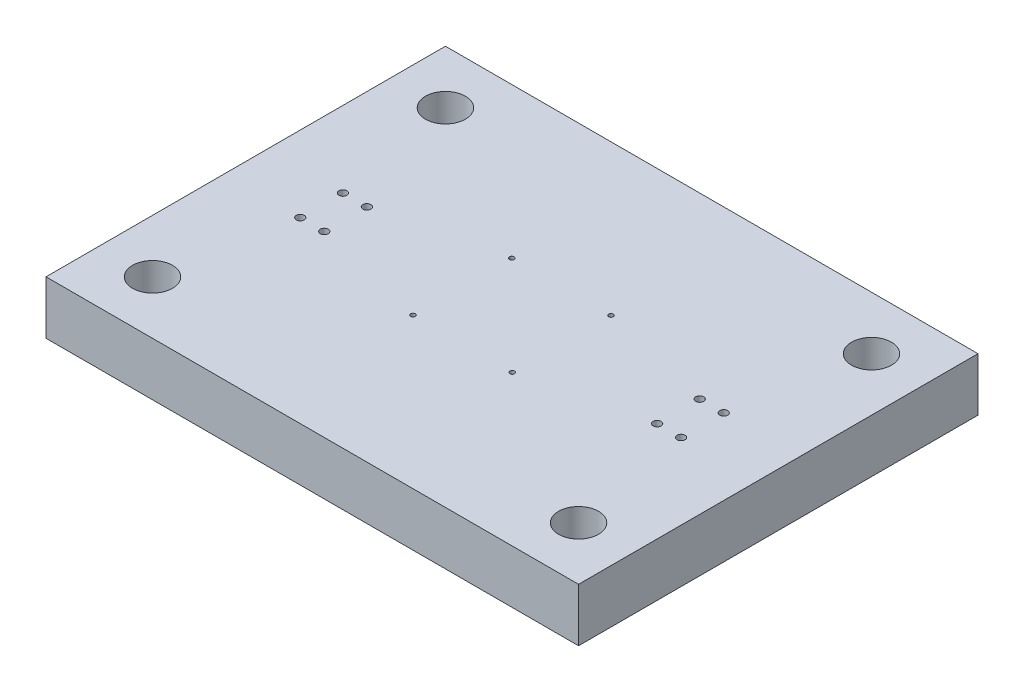
ISO-10303-21;
HEADER;
FILE_DESCRIPTION(('STEP AP214'),'2;1');
FILE_NAME('part.step','',(''),(''),'','','');
FILE_SCHEMA(('AUTOMOTIVE_DESIGN { 1 0 10303 214 1 1 1 1 }'));
ENDSEC;
DATA;
#1=APPLICATION_CONTEXT('core data for automotive mechanical design processes');
#2=APPLICATION_PROTOCOL_DEFINITION('international standard','automotive_design',2000,#1);
#3=PRODUCT_CONTEXT('',#1,'mechanical');
#4=PRODUCT('Part','Part','',(#3));
#5=PRODUCT_RELATED_PRODUCT_CATEGORY('part','',(#4));
#6=PRODUCT_DEFINITION_FORMATION('','',#4);
#7=PRODUCT_DEFINITION_CONTEXT('part definition',#1,'design');
#8=PRODUCT_DEFINITION('design','',#6,#7);
#9=PRODUCT_DEFINITION_SHAPE('','',#8);
#10=(LENGTH_UNIT() NAMED_UNIT(*) SI_UNIT(.MILLI.,.METRE.));
#11=(NAMED_UNIT(*) PLANE_ANGLE_UNIT() SI_UNIT($,.RADIAN.));
#12=(NAMED_UNIT(*) SI_UNIT($,.STERADIAN.) SOLID_ANGLE_UNIT());
#13=UNCERTAINTY_MEASURE_WITH_UNIT(LENGTH_MEASURE(1.E-05),#10,'distance_accuracy_value','');
#14=(GEOMETRIC_REPRESENTATION_CONTEXT(3) GLOBAL_UNCERTAINTY_ASSIGNED_CONTEXT((#13)) GLOBAL_UNIT_ASSIGNED_CONTEXT((#10,
#11,#12)) REPRESENTATION_CONTEXT('',''));
#15=CARTESIAN_POINT('',(0.,0.,0.));
#16=DIRECTION('',(0.,0.,1.));
#17=DIRECTION('',(1.,0.,0.));
#18=AXIS2_PLACEMENT_3D('',#15,#16,#17);
#19=CARTESIAN_POINT('',(100.,20.,-75.));
#20=DIRECTION('',(-1.,0.,0.));
#21=DIRECTION('',(0.,0.,1.));
#22=AXIS2_PLACEMENT_3D('',#19,#20,#21);
#23=PLANE('',#22);
#24=DIRECTION('',(0.,0.,-1.));
#25=VECTOR('',#24,1.);
#26=CARTESIAN_POINT('',(100.,0.,-75.));
#27=LINE('',#26,#25);
#28=CARTESIAN_POINT('',(100.,0.,75.));
#29=VERTEX_POINT('',#28);
#30=CARTESIAN_POINT('',(100.,0.,-75.));
#31=VERTEX_POINT('',#30);
#32=EDGE_CURVE('E99',#29,#31,#27,.T.);
#33=ORIENTED_EDGE('',*,*,#32,.T.);
#34=DIRECTION('',(0.,-1.,0.));
#35=VECTOR('',#34,1.);
#36=CARTESIAN_POINT('',(100.,20.,-75.));
#37=LINE('',#36,#35);
#38=CARTESIAN_POINT('',(100.,20.,-75.));
#39=VERTEX_POINT('',#38);
#40=EDGE_CURVE('E11',#39,#31,#37,.T.);
#41=ORIENTED_EDGE('',*,*,#40,.F.);
#42=DIRECTION('',(0.,0.,-1.));
#43=VECTOR('',#42,1.);
#44=CARTESIAN_POINT('',(100.,20.,-75.));
#45=LINE('',#44,#43);
#46=CARTESIAN_POINT('',(100.,20.,75.));
#47=VERTEX_POINT('',#46);
#48=EDGE_CURVE('E86',#47,#39,#45,.T.);
#49=ORIENTED_EDGE('',*,*,#48,.F.);
#50=DIRECTION('',(0.,-1.,0.));
#51=VECTOR('',#50,1.);
#52=CARTESIAN_POINT('',(100.,20.,75.));
#53=LINE('',#52,#51);
#54=EDGE_CURVE('E95',#47,#29,#53,.T.);
#55=ORIENTED_EDGE('',*,*,#54,.T.);
#56=EDGE_LOOP('',(#33,#41,#49,#55));
#57=FACE_BOUND('',#56,.T.);
#58=ADVANCED_FACE('F33',(#57),#23,.F.);
#59=CARTESIAN_POINT('',(-100.,20.,-75.));
#60=DIRECTION('',(0.,0.,1.));
#61=DIRECTION('',(1.,0.,0.));
#62=AXIS2_PLACEMENT_3D('',#59,#60,#61);
#63=PLANE('',#62);
#64=DIRECTION('',(-1.,0.,0.));
#65=VECTOR('',#64,1.);
#66=CARTESIAN_POINT('',(-100.,0.,-75.));
#67=LINE('',#66,#65);
#68=CARTESIAN_POINT('',(-100.,0.,-75.));
#69=VERTEX_POINT('',#68);
#70=EDGE_CURVE('E90',#31,#69,#67,.T.);
#71=ORIENTED_EDGE('',*,*,#70,.T.);
#72=DIRECTION('',(0.,-1.,0.));
#73=VECTOR('',#72,1.);
#74=CARTESIAN_POINT('',(-100.,20.,-75.));
#75=LINE('',#74,#73);
#76=CARTESIAN_POINT('',(-100.,20.,-75.));
#77=VERTEX_POINT('',#76);
#78=EDGE_CURVE('E42',#77,#69,#75,.T.);
#79=ORIENTED_EDGE('',*,*,#78,.F.);
#80=DIRECTION('',(-1.,0.,0.));
#81=VECTOR('',#80,1.);
#82=CARTESIAN_POINT('',(-100.,20.,-75.));
#83=LINE('',#82,#81);
#84=EDGE_CURVE('E81',#39,#77,#83,.T.);
#85=ORIENTED_EDGE('',*,*,#84,.F.);
#86=ORIENTED_EDGE('',*,*,#40,.T.);
#87=EDGE_LOOP('',(#71,#79,#85,#86));
#88=FACE_BOUND('',#87,.T.);
#89=ADVANCED_FACE('F89',(#88),#63,.F.);
#90=CARTESIAN_POINT('',(-100.,20.,-75.));
#91=DIRECTION('',(1.,0.,0.));
#92=DIRECTION('',(0.,0.,-1.));
#93=AXIS2_PLACEMENT_3D('',#90,#91,#92);
#94=PLANE('',#93);
#95=DIRECTION('',(0.,0.,1.));
#96=VECTOR('',#95,1.);
#97=CARTESIAN_POINT('',(-100.,0.,-75.));
#98=LINE('',#97,#96);
#99=CARTESIAN_POINT('',(-100.,0.,75.));
#100=VERTEX_POINT('',#99);
#101=EDGE_CURVE('E68',#69,#100,#98,.T.);
#102=ORIENTED_EDGE('',*,*,#101,.T.);
#103=DIRECTION('',(0.,-1.,0.));
#104=VECTOR('',#103,1.);
#105=CARTESIAN_POINT('',(-100.,20.,75.));
#106=LINE('',#105,#104);
#107=CARTESIAN_POINT('',(-100.,20.,75.));
#108=VERTEX_POINT('',#107);
#109=EDGE_CURVE('E91',#108,#100,#106,.T.);
#110=ORIENTED_EDGE('',*,*,#109,.F.);
#111=DIRECTION('',(0.,0.,1.));
#112=VECTOR('',#111,1.);
#113=CARTESIAN_POINT('',(-100.,20.,-75.));
#114=LINE('',#113,#112);
#115=EDGE_CURVE('E84',#77,#108,#114,.T.);
#116=ORIENTED_EDGE('',*,*,#115,.F.);
#117=ORIENTED_EDGE('',*,*,#78,.T.);
#118=EDGE_LOOP('',(#102,#110,#116,#117));
#119=FACE_BOUND('',#118,.T.);
#120=ADVANCED_FACE('F93',(#119),#94,.F.);
#121=CARTESIAN_POINT('',(-100.,20.,75.));
#122=DIRECTION('',(0.,0.,-1.));
#123=DIRECTION('',(-1.,0.,0.));
#124=AXIS2_PLACEMENT_3D('',#121,#122,#123);
#125=PLANE('',#124);
#126=DIRECTION('',(1.,0.,0.));
#127=VECTOR('',#126,1.);
#128=CARTESIAN_POINT('',(-100.,0.,75.));
#129=LINE('',#128,#127);
#130=EDGE_CURVE('E74',#100,#29,#129,.T.);
#131=ORIENTED_EDGE('',*,*,#130,.T.);
#132=ORIENTED_EDGE('',*,*,#54,.F.);
#133=DIRECTION('',(1.,0.,0.));
#134=VECTOR('',#133,1.);
#135=CARTESIAN_POINT('',(-100.,20.,75.));
#136=LINE('',#135,#134);
#137=EDGE_CURVE('E51',#108,#47,#136,.T.);
#138=ORIENTED_EDGE('',*,*,#137,.F.);
#139=ORIENTED_EDGE('',*,*,#109,.T.);
#140=EDGE_LOOP('',(#131,#132,#138,#139));
#141=FACE_BOUND('',#140,.T.);
#142=ADVANCED_FACE('F165',(#141),#125,.F.);
#143=CARTESIAN_POINT('',(0.,20.,0.));
#144=DIRECTION('',(0.,1.,0.));
#145=DIRECTION('',(0.,0.,1.));
#146=AXIS2_PLACEMENT_3D('',#143,#144,#145);
#147=PLANE('',#146);
#148=CARTESIAN_POINT('',(18.63,20.,-18.55));
#149=DIRECTION('',(0.,1.,0.));
#150=DIRECTION('',(0.,0.,-1.));
#151=AXIS2_PLACEMENT_3D('',#148,#149,#150);
#152=CIRCLE('',#151,0.875000000000002);
#153=CARTESIAN_POINT('',(18.63,20.,-19.425));
#154=VERTEX_POINT('',#153);
#155=EDGE_CURVE('E370',#154,#154,#152,.T.);
#156=ORIENTED_EDGE('',*,*,#155,.F.);
#157=EDGE_LOOP('',(#156));
#158=FACE_BOUND('',#157,.T.);
#159=CARTESIAN_POINT('',(-18.63,20.,18.55));
#160=DIRECTION('',(0.,1.,0.));
#161=DIRECTION('',(0.,0.,-1.));
#162=AXIS2_PLACEMENT_3D('',#159,#160,#161);
#163=CIRCLE('',#162,0.875000000000002);
#164=CARTESIAN_POINT('',(-18.63,20.,17.675));
#165=VERTEX_POINT('',#164);
#166=EDGE_CURVE('E376',#165,#165,#163,.T.);
#167=ORIENTED_EDGE('',*,*,#166,.F.);
#168=EDGE_LOOP('',(#167));
#169=FACE_BOUND('',#168,.T.);
#170=CARTESIAN_POINT('',(18.63,20.,18.55));
#171=DIRECTION('',(0.,1.,0.));
#172=DIRECTION('',(0.,0.,1.));
#173=AXIS2_PLACEMENT_3D('',#170,#171,#172);
#174=CIRCLE('',#173,0.875000000000002);
#175=CARTESIAN_POINT('',(18.63,20.,19.425));
#176=VERTEX_POINT('',#175);
#177=EDGE_CURVE('E468',#176,#176,#174,.T.);
#178=ORIENTED_EDGE('',*,*,#177,.F.);
#179=EDGE_LOOP('',(#178));
#180=FACE_BOUND('',#179,.T.);
#181=CARTESIAN_POINT('',(-18.63,20.,-18.55));
#182=DIRECTION('',(0.,1.,0.));
#183=DIRECTION('',(0.,0.,1.));
#184=AXIS2_PLACEMENT_3D('',#181,#182,#183);
#185=CIRCLE('',#184,0.875000000000002);
#186=CARTESIAN_POINT('',(-18.63,20.,-17.675));
#187=VERTEX_POINT('',#186);
#188=EDGE_CURVE('E373',#187,#187,#185,.T.);
#189=ORIENTED_EDGE('',*,*,#188,.F.);
#190=EDGE_LOOP('',(#189));
#191=FACE_BOUND('',#190,.T.);
#192=CARTESIAN_POINT('',(62.5,20.,-8.00000000000003));
#193=DIRECTION('',(0.,-1.,0.));
#194=DIRECTION('',(0.,0.,1.));
#195=AXIS2_PLACEMENT_3D('',#192,#193,#194);
#196=CIRCLE('',#195,1.50000000000002);
#197=CARTESIAN_POINT('',(62.5,20.,-6.50000000000001));
#198=VERTEX_POINT('',#197);
#199=EDGE_CURVE('E395',#198,#198,#196,.T.);
#200=ORIENTED_EDGE('',*,*,#199,.T.);
#201=EDGE_LOOP('',(#200));
#202=FACE_BOUND('',#201,.T.);
#203=CARTESIAN_POINT('',(-71.5,20.,-7.99999999999998));
#204=DIRECTION('',(0.,-1.,0.));
#205=DIRECTION('',(0.,0.,1.));
#206=AXIS2_PLACEMENT_3D('',#203,#204,#205);
#207=CIRCLE('',#206,1.5);
#208=CARTESIAN_POINT('',(-71.5,20.,-6.49999999999998));
#209=VERTEX_POINT('',#208);
#210=EDGE_CURVE('E398',#209,#209,#207,.T.);
#211=ORIENTED_EDGE('',*,*,#210,.T.);
#212=EDGE_LOOP('',(#211));
#213=FACE_BOUND('',#212,.T.);
#214=CARTESIAN_POINT('',(-62.5,20.,-7.99999999999997));
#215=DIRECTION('',(0.,-1.,0.));
#216=DIRECTION('',(0.,0.,-1.));
#217=AXIS2_PLACEMENT_3D('',#214,#215,#216);
#218=CIRCLE('',#217,1.5);
#219=CARTESIAN_POINT('',(-62.5,20.,-9.49999999999997));
#220=VERTEX_POINT('',#219);
#221=EDGE_CURVE('E401',#220,#220,#218,.T.);
#222=ORIENTED_EDGE('',*,*,#221,.T.);
#223=EDGE_LOOP('',(#222));
#224=FACE_BOUND('',#223,.T.);
#225=CARTESIAN_POINT('',(-62.5,20.,7.99999999999997));
#226=DIRECTION('',(0.,-1.,0.));
#227=DIRECTION('',(0.,0.,1.));
#228=AXIS2_PLACEMENT_3D('',#225,#226,#227);
#229=CIRCLE('',#228,1.5);
#230=CARTESIAN_POINT('',(-62.5,20.,9.49999999999997));
#231=VERTEX_POINT('',#230);
#232=EDGE_CURVE('E404',#231,#231,#229,.T.);
#233=ORIENTED_EDGE('',*,*,#232,.T.);
#234=EDGE_LOOP('',(#233));
#235=FACE_BOUND('',#234,.T.);
#236=CARTESIAN_POINT('',(71.5,20.,7.9999999999999));
#237=DIRECTION('',(0.,-1.,0.));
#238=DIRECTION('',(0.,0.,1.));
#239=AXIS2_PLACEMENT_3D('',#236,#237,#238);
#240=CIRCLE('',#239,1.5);
#241=CARTESIAN_POINT('',(71.5,20.,9.4999999999999));
#242=VERTEX_POINT('',#241);
#243=EDGE_CURVE('E386',#242,#242,#240,.T.);
#244=ORIENTED_EDGE('',*,*,#243,.T.);
#245=EDGE_LOOP('',(#244));
#246=FACE_BOUND('',#245,.T.);
#247=CARTESIAN_POINT('',(62.5,20.,7.99999999999992));
#248=DIRECTION('',(0.,-1.,0.));
#249=DIRECTION('',(0.,0.,-1.));
#250=AXIS2_PLACEMENT_3D('',#247,#248,#249);
#251=CIRCLE('',#250,1.49999999999999);
#252=CARTESIAN_POINT('',(62.5,20.,6.49999999999993));
#253=VERTEX_POINT('',#252);
#254=EDGE_CURVE('E391',#253,#253,#251,.T.);
#255=ORIENTED_EDGE('',*,*,#254,.T.);
#256=EDGE_LOOP('',(#255));
#257=FACE_BOUND('',#256,.T.);
#258=CARTESIAN_POINT('',(71.5,20.,-8.00000000000006));
#259=DIRECTION('',(0.,-1.,0.));
#260=DIRECTION('',(0.,0.,-1.));
#261=AXIS2_PLACEMENT_3D('',#258,#259,#260);
#262=CIRCLE('',#261,1.5);
#263=CARTESIAN_POINT('',(71.5,20.,-9.50000000000006));
#264=VERTEX_POINT('',#263);
#265=EDGE_CURVE('E392',#264,#264,#262,.T.);
#266=ORIENTED_EDGE('',*,*,#265,.T.);
#267=EDGE_LOOP('',(#266));
#268=FACE_BOUND('',#267,.T.);
#269=CARTESIAN_POINT('',(-71.5,20.,7.99999999999999));
#270=DIRECTION('',(0.,-1.,0.));
#271=DIRECTION('',(0.,0.,-1.));
#272=AXIS2_PLACEMENT_3D('',#269,#270,#271);
#273=CIRCLE('',#272,1.5);
#274=CARTESIAN_POINT('',(-71.5,20.,6.49999999999999));
#275=VERTEX_POINT('',#274);
#276=EDGE_CURVE('E112',#275,#275,#273,.T.);
#277=ORIENTED_EDGE('',*,*,#276,.T.);
#278=EDGE_LOOP('',(#277));
#279=FACE_BOUND('',#278,.T.);
#280=CARTESIAN_POINT('',(80.,20.,-54.9999999999999));
#281=DIRECTION('',(0.,1.,0.));
#282=DIRECTION('',(0.,0.,-1.));
#283=AXIS2_PLACEMENT_3D('',#280,#281,#282);
#284=CIRCLE('',#283,7.50000000000003);
#285=CARTESIAN_POINT('',(80.,20.,-62.4999999999999));
#286=VERTEX_POINT('',#285);
#287=EDGE_CURVE('E148',#286,#286,#284,.T.);
#288=ORIENTED_EDGE('',*,*,#287,.F.);
#289=EDGE_LOOP('',(#288));
#290=FACE_BOUND('',#289,.T.);
#291=CARTESIAN_POINT('',(-80.,20.,54.9999999999999));
#292=DIRECTION('',(0.,1.,0.));
#293=DIRECTION('',(0.,0.,-1.));
#294=AXIS2_PLACEMENT_3D('',#291,#292,#293);
#295=CIRCLE('',#294,7.50000000000002);
#296=CARTESIAN_POINT('',(-80.,20.,47.4999999999999));
#297=VERTEX_POINT('',#296);
#298=EDGE_CURVE('E140',#297,#297,#295,.T.);
#299=ORIENTED_EDGE('',*,*,#298,.F.);
#300=EDGE_LOOP('',(#299));
#301=FACE_BOUND('',#300,.T.);
#302=CARTESIAN_POINT('',(80.,20.,55.));
#303=DIRECTION('',(0.,1.,0.));
#304=DIRECTION('',(0.,0.,1.));
#305=AXIS2_PLACEMENT_3D('',#302,#303,#304);
#306=CIRCLE('',#305,7.50000000000002);
#307=CARTESIAN_POINT('',(80.,20.,62.5));
#308=VERTEX_POINT('',#307);
#309=EDGE_CURVE('E131',#308,#308,#306,.T.);
#310=ORIENTED_EDGE('',*,*,#309,.F.);
#311=EDGE_LOOP('',(#310));
#312=FACE_BOUND('',#311,.T.);
#313=CARTESIAN_POINT('',(-80.,20.,-55.));
#314=DIRECTION('',(0.,1.,0.));
#315=DIRECTION('',(0.,0.,1.));
#316=AXIS2_PLACEMENT_3D('',#313,#314,#315);
#317=CIRCLE('',#316,7.50000000000001);
#318=CARTESIAN_POINT('',(-80.,20.,-47.5));
#319=VERTEX_POINT('',#318);
#320=EDGE_CURVE('E147',#319,#319,#317,.T.);
#321=ORIENTED_EDGE('',*,*,#320,.F.);
#322=EDGE_LOOP('',(#321));
#323=FACE_BOUND('',#322,.T.);
#324=ORIENTED_EDGE('',*,*,#48,.T.);
#325=ORIENTED_EDGE('',*,*,#84,.T.);
#326=ORIENTED_EDGE('',*,*,#115,.T.);
#327=ORIENTED_EDGE('',*,*,#137,.T.);
#328=EDGE_LOOP('',(#324,#325,#326,#327));
#329=FACE_BOUND('',#328,.T.);
#330=ADVANCED_FACE('F82',(#158,#169,#180,#191,#202,#213,#224,#235,#246,#257,#268,#279,#290,#301,
#312,#323,#329),#147,.T.);
#331=CARTESIAN_POINT('',(0.,0.,0.));
#332=DIRECTION('',(0.,1.,0.));
#333=DIRECTION('',(0.,0.,1.));
#334=AXIS2_PLACEMENT_3D('',#331,#332,#333);
#335=PLANE('',#334);
#336=CARTESIAN_POINT('',(18.63,0.,-18.55));
#337=DIRECTION('',(0.,1.,0.));
#338=DIRECTION('',(0.,0.,-1.));
#339=AXIS2_PLACEMENT_3D('',#336,#337,#338);
#340=CIRCLE('',#339,0.875000000000002);
#341=CARTESIAN_POINT('',(18.63,0.,-19.425));
#342=VERTEX_POINT('',#341);
#343=EDGE_CURVE('E368',#342,#342,#340,.T.);
#344=ORIENTED_EDGE('',*,*,#343,.T.);
#345=EDGE_LOOP('',(#344));
#346=FACE_BOUND('',#345,.T.);
#347=CARTESIAN_POINT('',(-18.63,0.,18.55));
#348=DIRECTION('',(0.,1.,0.));
#349=DIRECTION('',(0.,0.,-1.));
#350=AXIS2_PLACEMENT_3D('',#347,#348,#349);
#351=CIRCLE('',#350,0.875000000000002);
#352=CARTESIAN_POINT('',(-18.63,0.,17.675));
#353=VERTEX_POINT('',#352);
#354=EDGE_CURVE('E371',#353,#353,#351,.T.);
#355=ORIENTED_EDGE('',*,*,#354,.T.);
#356=EDGE_LOOP('',(#355));
#357=FACE_BOUND('',#356,.T.);
#358=CARTESIAN_POINT('',(18.63,0.,18.55));
#359=DIRECTION('',(0.,1.,0.));
#360=DIRECTION('',(0.,0.,1.));
#361=AXIS2_PLACEMENT_3D('',#358,#359,#360);
#362=CIRCLE('',#361,0.875000000000002);
#363=CARTESIAN_POINT('',(18.63,0.,19.425));
#364=VERTEX_POINT('',#363);
#365=EDGE_CURVE('E382',#364,#364,#362,.T.);
#366=ORIENTED_EDGE('',*,*,#365,.T.);
#367=EDGE_LOOP('',(#366));
#368=FACE_BOUND('',#367,.T.);
#369=CARTESIAN_POINT('',(-18.63,0.,-18.55));
#370=DIRECTION('',(0.,1.,0.));
#371=DIRECTION('',(0.,0.,1.));
#372=AXIS2_PLACEMENT_3D('',#369,#370,#371);
#373=CIRCLE('',#372,0.875000000000002);
#374=CARTESIAN_POINT('',(-18.63,0.,-17.675));
#375=VERTEX_POINT('',#374);
#376=EDGE_CURVE('E383',#375,#375,#373,.T.);
#377=ORIENTED_EDGE('',*,*,#376,.T.);
#378=EDGE_LOOP('',(#377));
#379=FACE_BOUND('',#378,.T.);
#380=CARTESIAN_POINT('',(62.5,0.,-8.00000000000003));
#381=DIRECTION('',(0.,1.,0.));
#382=DIRECTION('',(0.,0.,1.));
#383=AXIS2_PLACEMENT_3D('',#380,#381,#382);
#384=CIRCLE('',#383,1.50000000000002);
#385=CARTESIAN_POINT('',(62.5,0.,-6.50000000000001));
#386=VERTEX_POINT('',#385);
#387=EDGE_CURVE('E36',#386,#386,#384,.T.);
#388=ORIENTED_EDGE('',*,*,#387,.T.);
#389=EDGE_LOOP('',(#388));
#390=FACE_BOUND('',#389,.T.);
#391=CARTESIAN_POINT('',(-71.5,0.,-7.99999999999998));
#392=DIRECTION('',(0.,1.,0.));
#393=DIRECTION('',(0.,0.,1.));
#394=AXIS2_PLACEMENT_3D('',#391,#392,#393);
#395=CIRCLE('',#394,1.5);
#396=CARTESIAN_POINT('',(-71.5,0.,-6.49999999999998));
#397=VERTEX_POINT('',#396);
#398=EDGE_CURVE('E126',#397,#397,#395,.T.);
#399=ORIENTED_EDGE('',*,*,#398,.T.);
#400=EDGE_LOOP('',(#399));
#401=FACE_BOUND('',#400,.T.);
#402=CARTESIAN_POINT('',(-62.5,0.,-7.99999999999997));
#403=DIRECTION('',(0.,1.,0.));
#404=DIRECTION('',(0.,0.,1.));
#405=AXIS2_PLACEMENT_3D('',#402,#403,#404);
#406=CIRCLE('',#405,1.5);
#407=CARTESIAN_POINT('',(-62.5,0.,-6.49999999999997));
#408=VERTEX_POINT('',#407);
#409=EDGE_CURVE('E124',#408,#408,#406,.T.);
#410=ORIENTED_EDGE('',*,*,#409,.T.);
#411=EDGE_LOOP('',(#410));
#412=FACE_BOUND('',#411,.T.);
#413=CARTESIAN_POINT('',(-62.5,0.,7.99999999999997));
#414=DIRECTION('',(0.,1.,0.));
#415=DIRECTION('',(0.,0.,1.));
#416=AXIS2_PLACEMENT_3D('',#413,#414,#415);
#417=CIRCLE('',#416,1.5);
#418=CARTESIAN_POINT('',(-62.5,0.,9.49999999999997));
#419=VERTEX_POINT('',#418);
#420=EDGE_CURVE('E121',#419,#419,#417,.T.);
#421=ORIENTED_EDGE('',*,*,#420,.T.);
#422=EDGE_LOOP('',(#421));
#423=FACE_BOUND('',#422,.T.);
#424=CARTESIAN_POINT('',(71.5,0.,7.9999999999999));
#425=DIRECTION('',(0.,1.,0.));
#426=DIRECTION('',(0.,0.,1.));
#427=AXIS2_PLACEMENT_3D('',#424,#425,#426);
#428=CIRCLE('',#427,1.5);
#429=CARTESIAN_POINT('',(71.5,0.,9.4999999999999));
#430=VERTEX_POINT('',#429);
#431=EDGE_CURVE('E118',#430,#430,#428,.T.);
#432=ORIENTED_EDGE('',*,*,#431,.T.);
#433=EDGE_LOOP('',(#432));
#434=FACE_BOUND('',#433,.T.);
#435=CARTESIAN_POINT('',(62.5,0.,7.99999999999992));
#436=DIRECTION('',(0.,1.,0.));
#437=DIRECTION('',(0.,0.,1.));
#438=AXIS2_PLACEMENT_3D('',#435,#436,#437);
#439=CIRCLE('',#438,1.49999999999999);
#440=CARTESIAN_POINT('',(62.5,0.,9.49999999999991));
#441=VERTEX_POINT('',#440);
#442=EDGE_CURVE('E115',#441,#441,#439,.T.);
#443=ORIENTED_EDGE('',*,*,#442,.T.);
#444=EDGE_LOOP('',(#443));
#445=FACE_BOUND('',#444,.T.);
#446=CARTESIAN_POINT('',(71.5,0.,-8.00000000000006));
#447=DIRECTION('',(0.,1.,0.));
#448=DIRECTION('',(0.,0.,1.));
#449=AXIS2_PLACEMENT_3D('',#446,#447,#448);
#450=CIRCLE('',#449,1.5);
#451=CARTESIAN_POINT('',(71.5,0.,-6.50000000000006));
#452=VERTEX_POINT('',#451);
#453=EDGE_CURVE('E111',#452,#452,#450,.T.);
#454=ORIENTED_EDGE('',*,*,#453,.T.);
#455=EDGE_LOOP('',(#454));
#456=FACE_BOUND('',#455,.T.);
#457=CARTESIAN_POINT('',(-71.5,0.,7.99999999999999));
#458=DIRECTION('',(0.,1.,0.));
#459=DIRECTION('',(0.,0.,1.));
#460=AXIS2_PLACEMENT_3D('',#457,#458,#459);
#461=CIRCLE('',#460,1.5);
#462=CARTESIAN_POINT('',(-71.5,0.,9.49999999999998));
#463=VERTEX_POINT('',#462);
#464=EDGE_CURVE('E108',#463,#463,#461,.T.);
#465=ORIENTED_EDGE('',*,*,#464,.T.);
#466=EDGE_LOOP('',(#465));
#467=FACE_BOUND('',#466,.T.);
#468=CARTESIAN_POINT('',(80.,0.,-54.9999999999999));
#469=DIRECTION('',(0.,1.,0.));
#470=DIRECTION('',(0.,0.,-1.));
#471=AXIS2_PLACEMENT_3D('',#468,#469,#470);
#472=CIRCLE('',#471,7.50000000000003);
#473=CARTESIAN_POINT('',(80.,0.,-62.4999999999999));
#474=VERTEX_POINT('',#473);
#475=EDGE_CURVE('E144',#474,#474,#472,.T.);
#476=ORIENTED_EDGE('',*,*,#475,.T.);
#477=EDGE_LOOP('',(#476));
#478=FACE_BOUND('',#477,.T.);
#479=CARTESIAN_POINT('',(-80.,0.,54.9999999999999));
#480=DIRECTION('',(0.,1.,0.));
#481=DIRECTION('',(0.,0.,-1.));
#482=AXIS2_PLACEMENT_3D('',#479,#480,#481);
#483=CIRCLE('',#482,7.50000000000002);
#484=CARTESIAN_POINT('',(-80.,0.,47.4999999999999));
#485=VERTEX_POINT('',#484);
#486=EDGE_CURVE('E151',#485,#485,#483,.T.);
#487=ORIENTED_EDGE('',*,*,#486,.T.);
#488=EDGE_LOOP('',(#487));
#489=FACE_BOUND('',#488,.T.);
#490=CARTESIAN_POINT('',(80.,0.,55.));
#491=DIRECTION('',(0.,1.,0.));
#492=DIRECTION('',(0.,0.,1.));
#493=AXIS2_PLACEMENT_3D('',#490,#491,#492);
#494=CIRCLE('',#493,7.50000000000002);
#495=CARTESIAN_POINT('',(80.,0.,62.5));
#496=VERTEX_POINT('',#495);
#497=EDGE_CURVE('E135',#496,#496,#494,.T.);
#498=ORIENTED_EDGE('',*,*,#497,.T.);
#499=EDGE_LOOP('',(#498));
#500=FACE_BOUND('',#499,.T.);
#501=CARTESIAN_POINT('',(-80.,0.,-55.));
#502=DIRECTION('',(0.,1.,0.));
#503=DIRECTION('',(0.,0.,1.));
#504=AXIS2_PLACEMENT_3D('',#501,#502,#503);
#505=CIRCLE('',#504,7.50000000000001);
#506=CARTESIAN_POINT('',(-80.,0.,-47.5));
#507=VERTEX_POINT('',#506);
#508=EDGE_CURVE('E102',#507,#507,#505,.T.);
#509=ORIENTED_EDGE('',*,*,#508,.T.);
#510=EDGE_LOOP('',(#509));
#511=FACE_BOUND('',#510,.T.);
#512=ORIENTED_EDGE('',*,*,#32,.F.);
#513=ORIENTED_EDGE('',*,*,#130,.F.);
#514=ORIENTED_EDGE('',*,*,#101,.F.);
#515=ORIENTED_EDGE('',*,*,#70,.F.);
#516=EDGE_LOOP('',(#512,#513,#514,#515));
#517=FACE_BOUND('',#516,.T.);
#518=ADVANCED_FACE('F164',(#346,#357,#368,#379,#390,#401,#412,#423,#434,#445,#456,#467,#478,
#489,#500,#511,#517),#335,.F.);
#519=CARTESIAN_POINT('',(-80.,0.,-55.));
#520=DIRECTION('',(0.,1.,0.));
#521=DIRECTION('',(0.,0.,1.));
#522=AXIS2_PLACEMENT_3D('',#519,#520,#521);
#523=CYLINDRICAL_SURFACE('',#522,7.50000000000001);
#524=ORIENTED_EDGE('',*,*,#508,.F.);
#525=EDGE_LOOP('',(#524));
#526=FACE_BOUND('',#525,.T.);
#527=ORIENTED_EDGE('',*,*,#320,.T.);
#528=EDGE_LOOP('',(#527));
#529=FACE_BOUND('',#528,.T.);
#530=ADVANCED_FACE('F161',(#526,#529),#523,.F.);
#531=CARTESIAN_POINT('',(80.,0.,55.));
#532=DIRECTION('',(0.,1.,0.));
#533=DIRECTION('',(0.,0.,1.));
#534=AXIS2_PLACEMENT_3D('',#531,#532,#533);
#535=CYLINDRICAL_SURFACE('',#534,7.50000000000002);
#536=ORIENTED_EDGE('',*,*,#497,.F.);
#537=EDGE_LOOP('',(#536));
#538=FACE_BOUND('',#537,.T.);
#539=ORIENTED_EDGE('',*,*,#309,.T.);
#540=EDGE_LOOP('',(#539));
#541=FACE_BOUND('',#540,.T.);
#542=ADVANCED_FACE('F214',(#538,#541),#535,.F.);
#543=CARTESIAN_POINT('',(-80.,0.,54.9999999999999));
#544=DIRECTION('',(0.,1.,0.));
#545=DIRECTION('',(0.,0.,1.));
#546=AXIS2_PLACEMENT_3D('',#543,#544,#545);
#547=CYLINDRICAL_SURFACE('',#546,7.50000000000002);
#548=ORIENTED_EDGE('',*,*,#486,.F.);
#549=EDGE_LOOP('',(#548));
#550=FACE_BOUND('',#549,.T.);
#551=ORIENTED_EDGE('',*,*,#298,.T.);
#552=EDGE_LOOP('',(#551));
#553=FACE_BOUND('',#552,.T.);
#554=ADVANCED_FACE('F220',(#550,#553),#547,.F.);
#555=CARTESIAN_POINT('',(80.,0.,-54.9999999999999));
#556=DIRECTION('',(0.,1.,0.));
#557=DIRECTION('',(0.,0.,1.));
#558=AXIS2_PLACEMENT_3D('',#555,#556,#557);
#559=CYLINDRICAL_SURFACE('',#558,7.50000000000003);
#560=ORIENTED_EDGE('',*,*,#475,.F.);
#561=EDGE_LOOP('',(#560));
#562=FACE_BOUND('',#561,.T.);
#563=ORIENTED_EDGE('',*,*,#287,.T.);
#564=EDGE_LOOP('',(#563));
#565=FACE_BOUND('',#564,.T.);
#566=ADVANCED_FACE('F228',(#562,#565),#559,.F.);
#567=CARTESIAN_POINT('',(-71.5,20.,7.99999999999999));
#568=DIRECTION('',(0.,-1.,0.));
#569=DIRECTION('',(0.,0.,-1.));
#570=AXIS2_PLACEMENT_3D('',#567,#568,#569);
#571=CYLINDRICAL_SURFACE('',#570,1.5);
#572=ORIENTED_EDGE('',*,*,#276,.F.);
#573=EDGE_LOOP('',(#572));
#574=FACE_BOUND('',#573,.T.);
#575=ORIENTED_EDGE('',*,*,#464,.F.);
#576=EDGE_LOOP('',(#575));
#577=FACE_BOUND('',#576,.T.);
#578=ADVANCED_FACE('F236',(#574,#577),#571,.F.);
#579=CARTESIAN_POINT('',(71.5,20.,-8.00000000000006));
#580=DIRECTION('',(0.,-1.,0.));
#581=DIRECTION('',(0.,0.,-1.));
#582=AXIS2_PLACEMENT_3D('',#579,#580,#581);
#583=CYLINDRICAL_SURFACE('',#582,1.5);
#584=ORIENTED_EDGE('',*,*,#265,.F.);
#585=EDGE_LOOP('',(#584));
#586=FACE_BOUND('',#585,.T.);
#587=ORIENTED_EDGE('',*,*,#453,.F.);
#588=EDGE_LOOP('',(#587));
#589=FACE_BOUND('',#588,.T.);
#590=ADVANCED_FACE('F244',(#586,#589),#583,.F.);
#591=CARTESIAN_POINT('',(62.5,20.,7.99999999999992));
#592=DIRECTION('',(0.,-1.,0.));
#593=DIRECTION('',(0.,0.,-1.));
#594=AXIS2_PLACEMENT_3D('',#591,#592,#593);
#595=CYLINDRICAL_SURFACE('',#594,1.49999999999999);
#596=ORIENTED_EDGE('',*,*,#254,.F.);
#597=EDGE_LOOP('',(#596));
#598=FACE_BOUND('',#597,.T.);
#599=ORIENTED_EDGE('',*,*,#442,.F.);
#600=EDGE_LOOP('',(#599));
#601=FACE_BOUND('',#600,.T.);
#602=ADVANCED_FACE('F252',(#598,#601),#595,.F.);
#603=CARTESIAN_POINT('',(71.5,20.,7.9999999999999));
#604=DIRECTION('',(0.,-1.,0.));
#605=DIRECTION('',(0.,0.,-1.));
#606=AXIS2_PLACEMENT_3D('',#603,#604,#605);
#607=CYLINDRICAL_SURFACE('',#606,1.5);
#608=ORIENTED_EDGE('',*,*,#243,.F.);
#609=EDGE_LOOP('',(#608));
#610=FACE_BOUND('',#609,.T.);
#611=ORIENTED_EDGE('',*,*,#431,.F.);
#612=EDGE_LOOP('',(#611));
#613=FACE_BOUND('',#612,.T.);
#614=ADVANCED_FACE('F260',(#610,#613),#607,.F.);
#615=CARTESIAN_POINT('',(-62.5,20.,7.99999999999997));
#616=DIRECTION('',(0.,-1.,0.));
#617=DIRECTION('',(0.,0.,-1.));
#618=AXIS2_PLACEMENT_3D('',#615,#616,#617);
#619=CYLINDRICAL_SURFACE('',#618,1.5);
#620=ORIENTED_EDGE('',*,*,#232,.F.);
#621=EDGE_LOOP('',(#620));
#622=FACE_BOUND('',#621,.T.);
#623=ORIENTED_EDGE('',*,*,#420,.F.);
#624=EDGE_LOOP('',(#623));
#625=FACE_BOUND('',#624,.T.);
#626=ADVANCED_FACE('F268',(#622,#625),#619,.F.);
#627=CARTESIAN_POINT('',(-62.5,20.,-7.99999999999997));
#628=DIRECTION('',(0.,-1.,0.));
#629=DIRECTION('',(0.,0.,-1.));
#630=AXIS2_PLACEMENT_3D('',#627,#628,#629);
#631=CYLINDRICAL_SURFACE('',#630,1.5);
#632=ORIENTED_EDGE('',*,*,#221,.F.);
#633=EDGE_LOOP('',(#632));
#634=FACE_BOUND('',#633,.T.);
#635=ORIENTED_EDGE('',*,*,#409,.F.);
#636=EDGE_LOOP('',(#635));
#637=FACE_BOUND('',#636,.T.);
#638=ADVANCED_FACE('F276',(#634,#637),#631,.F.);
#639=CARTESIAN_POINT('',(-71.5,20.,-7.99999999999998));
#640=DIRECTION('',(0.,-1.,0.));
#641=DIRECTION('',(0.,0.,-1.));
#642=AXIS2_PLACEMENT_3D('',#639,#640,#641);
#643=CYLINDRICAL_SURFACE('',#642,1.5);
#644=ORIENTED_EDGE('',*,*,#210,.F.);
#645=EDGE_LOOP('',(#644));
#646=FACE_BOUND('',#645,.T.);
#647=ORIENTED_EDGE('',*,*,#398,.F.);
#648=EDGE_LOOP('',(#647));
#649=FACE_BOUND('',#648,.T.);
#650=ADVANCED_FACE('F284',(#646,#649),#643,.F.);
#651=CARTESIAN_POINT('',(62.5,20.,-8.00000000000003));
#652=DIRECTION('',(0.,-1.,0.));
#653=DIRECTION('',(0.,0.,-1.));
#654=AXIS2_PLACEMENT_3D('',#651,#652,#653);
#655=CYLINDRICAL_SURFACE('',#654,1.50000000000002);
#656=ORIENTED_EDGE('',*,*,#199,.F.);
#657=EDGE_LOOP('',(#656));
#658=FACE_BOUND('',#657,.T.);
#659=ORIENTED_EDGE('',*,*,#387,.F.);
#660=EDGE_LOOP('',(#659));
#661=FACE_BOUND('',#660,.T.);
#662=ADVANCED_FACE('F292',(#658,#661),#655,.F.);
#663=CARTESIAN_POINT('',(-18.63,0.,-18.55));
#664=DIRECTION('',(0.,1.,0.));
#665=DIRECTION('',(0.,0.,1.));
#666=AXIS2_PLACEMENT_3D('',#663,#664,#665);
#667=CYLINDRICAL_SURFACE('',#666,0.875000000000002);
#668=ORIENTED_EDGE('',*,*,#376,.F.);
#669=EDGE_LOOP('',(#668));
#670=FACE_BOUND('',#669,.T.);
#671=ORIENTED_EDGE('',*,*,#188,.T.);
#672=EDGE_LOOP('',(#671));
#673=FACE_BOUND('',#672,.T.);
#674=ADVANCED_FACE('F299',(#670,#673),#667,.F.);
#675=CARTESIAN_POINT('',(18.63,0.,18.55));
#676=DIRECTION('',(0.,1.,0.));
#677=DIRECTION('',(0.,0.,1.));
#678=AXIS2_PLACEMENT_3D('',#675,#676,#677);
#679=CYLINDRICAL_SURFACE('',#678,0.875000000000002);
#680=ORIENTED_EDGE('',*,*,#365,.F.);
#681=EDGE_LOOP('',(#680));
#682=FACE_BOUND('',#681,.T.);
#683=ORIENTED_EDGE('',*,*,#177,.T.);
#684=EDGE_LOOP('',(#683));
#685=FACE_BOUND('',#684,.T.);
#686=ADVANCED_FACE('F306',(#682,#685),#679,.F.);
#687=CARTESIAN_POINT('',(-18.63,0.,18.55));
#688=DIRECTION('',(0.,1.,0.));
#689=DIRECTION('',(0.,0.,1.));
#690=AXIS2_PLACEMENT_3D('',#687,#688,#689);
#691=CYLINDRICAL_SURFACE('',#690,0.875000000000002);
#692=ORIENTED_EDGE('',*,*,#354,.F.);
#693=EDGE_LOOP('',(#692));
#694=FACE_BOUND('',#693,.T.);
#695=ORIENTED_EDGE('',*,*,#166,.T.);
#696=EDGE_LOOP('',(#695));
#697=FACE_BOUND('',#696,.T.);
#698=ADVANCED_FACE('F314',(#694,#697),#691,.F.);
#699=CARTESIAN_POINT('',(18.63,0.,-18.55));
#700=DIRECTION('',(0.,1.,0.));
#701=DIRECTION('',(0.,0.,1.));
#702=AXIS2_PLACEMENT_3D('',#699,#700,#701);
#703=CYLINDRICAL_SURFACE('',#702,0.875000000000002);
#704=ORIENTED_EDGE('',*,*,#343,.F.);
#705=EDGE_LOOP('',(#704));
#706=FACE_BOUND('',#705,.T.);
#707=ORIENTED_EDGE('',*,*,#155,.T.);
#708=EDGE_LOOP('',(#707));
#709=FACE_BOUND('',#708,.T.);
#710=ADVANCED_FACE('F322',(#706,#709),#703,.F.);
#711=CLOSED_SHELL('',(#58,#89,#120,#142,#330,#518,#530,#542,#554,#566,#578,#590,#602,#614,#626,
#638,#650,#662,#674,#686,#698,#710));
#712=MANIFOLD_SOLID_BREP('B2',#711);
#713=ADVANCED_BREP_SHAPE_REPRESENTATION('',(#18,#712),#14);
#714=SHAPE_DEFINITION_REPRESENTATION(#9,#713);
ENDSEC;
END-ISO-10303-21;
